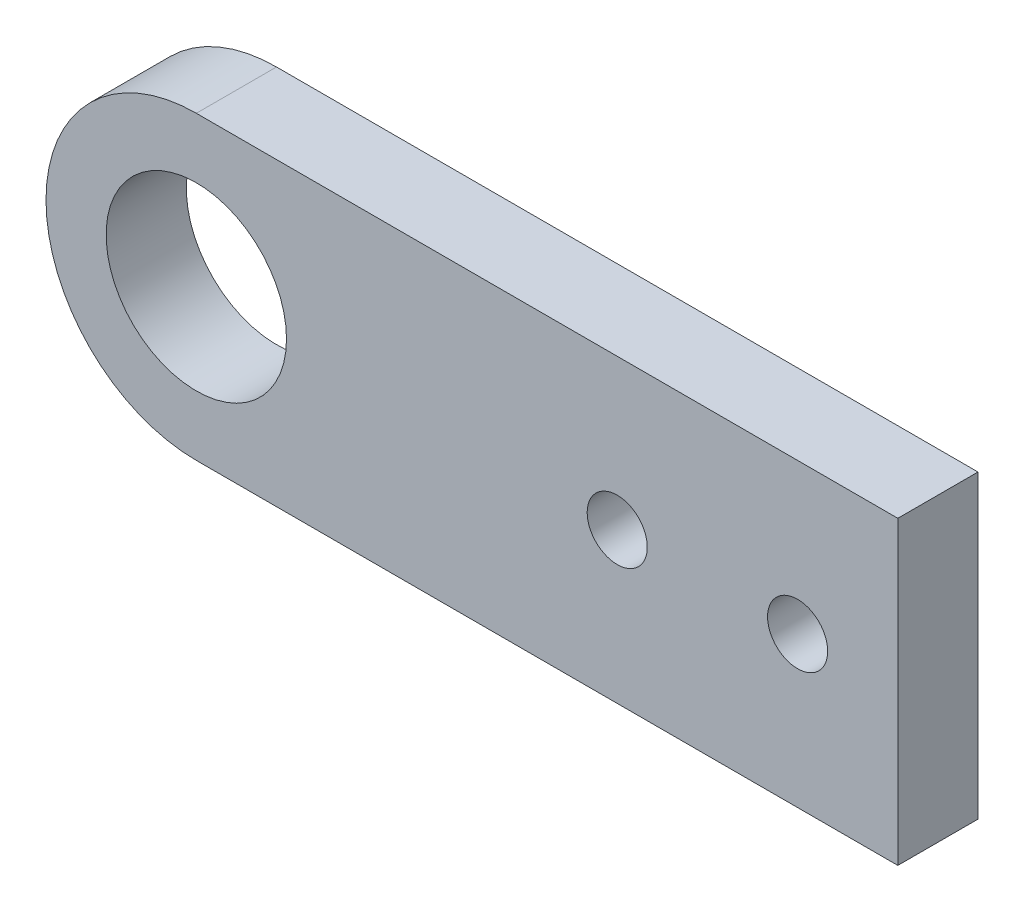
ISO-10303-21;
HEADER;
FILE_DESCRIPTION(('STEP AP214'),'2;1');
FILE_NAME('part.step','',(''),(''),'','','');
FILE_SCHEMA(('AUTOMOTIVE_DESIGN { 1 0 10303 214 1 1 1 1 }'));
ENDSEC;
DATA;
#1=APPLICATION_CONTEXT('core data for automotive mechanical design processes');
#2=APPLICATION_PROTOCOL_DEFINITION('international standard','automotive_design',2000,#1);
#3=PRODUCT_CONTEXT('',#1,'mechanical');
#4=PRODUCT('Part','Part','',(#3));
#5=PRODUCT_RELATED_PRODUCT_CATEGORY('part','',(#4));
#6=PRODUCT_DEFINITION_FORMATION('','',#4);
#7=PRODUCT_DEFINITION_CONTEXT('part definition',#1,'design');
#8=PRODUCT_DEFINITION('design','',#6,#7);
#9=PRODUCT_DEFINITION_SHAPE('','',#8);
#10=(LENGTH_UNIT() NAMED_UNIT(*) SI_UNIT(.MILLI.,.METRE.));
#11=(NAMED_UNIT(*) PLANE_ANGLE_UNIT() SI_UNIT($,.RADIAN.));
#12=(NAMED_UNIT(*) SI_UNIT($,.STERADIAN.) SOLID_ANGLE_UNIT());
#13=UNCERTAINTY_MEASURE_WITH_UNIT(LENGTH_MEASURE(1.E-05),#10,'distance_accuracy_value','');
#14=(GEOMETRIC_REPRESENTATION_CONTEXT(3) GLOBAL_UNCERTAINTY_ASSIGNED_CONTEXT((#13)) GLOBAL_UNIT_ASSIGNED_CONTEXT((#10,
#11,#12)) REPRESENTATION_CONTEXT('',''));
#15=CARTESIAN_POINT('',(0.,0.,0.));
#16=DIRECTION('',(0.,0.,1.));
#17=DIRECTION('',(1.,0.,0.));
#18=AXIS2_PLACEMENT_3D('',#15,#16,#17);
#19=CARTESIAN_POINT('',(0.,15.,8.));
#20=DIRECTION('',(0.,0.,-1.));
#21=DIRECTION('',(-1.,0.,0.));
#22=AXIS2_PLACEMENT_3D('',#19,#20,#21);
#23=CYLINDRICAL_SURFACE('',#22,15.);
#24=CARTESIAN_POINT('',(0.,15.,0.));
#25=DIRECTION('',(0.,0.,1.));
#26=DIRECTION('',(1.,0.,0.));
#27=AXIS2_PLACEMENT_3D('',#24,#25,#26);
#28=CIRCLE('',#27,15.);
#29=CARTESIAN_POINT('',(0.,30.,0.));
#30=VERTEX_POINT('',#29);
#31=CARTESIAN_POINT('',(0.,0.,0.));
#32=VERTEX_POINT('',#31);
#33=EDGE_CURVE('E107',#30,#32,#28,.T.);
#34=ORIENTED_EDGE('',*,*,#33,.T.);
#35=DIRECTION('',(0.,0.,-1.));
#36=VECTOR('',#35,1.);
#37=CARTESIAN_POINT('',(0.,0.,8.));
#38=LINE('',#37,#36);
#39=CARTESIAN_POINT('',(0.,0.,8.));
#40=VERTEX_POINT('',#39);
#41=EDGE_CURVE('E11',#40,#32,#38,.T.);
#42=ORIENTED_EDGE('',*,*,#41,.F.);
#43=CARTESIAN_POINT('',(0.,15.,8.));
#44=DIRECTION('',(0.,0.,1.));
#45=DIRECTION('',(1.,0.,0.));
#46=AXIS2_PLACEMENT_3D('',#43,#44,#45);
#47=CIRCLE('',#46,15.);
#48=CARTESIAN_POINT('',(0.,30.,8.));
#49=VERTEX_POINT('',#48);
#50=EDGE_CURVE('E93',#49,#40,#47,.T.);
#51=ORIENTED_EDGE('',*,*,#50,.F.);
#52=DIRECTION('',(0.,0.,-1.));
#53=VECTOR('',#52,1.);
#54=CARTESIAN_POINT('',(0.,30.,8.));
#55=LINE('',#54,#53);
#56=EDGE_CURVE('E60',#49,#30,#55,.T.);
#57=ORIENTED_EDGE('',*,*,#56,.T.);
#58=EDGE_LOOP('',(#34,#42,#51,#57));
#59=FACE_BOUND('',#58,.T.);
#60=ADVANCED_FACE('F44',(#59),#23,.T.);
#61=CARTESIAN_POINT('',(0.,0.,8.));
#62=DIRECTION('',(0.,1.,0.));
#63=DIRECTION('',(0.,0.,1.));
#64=AXIS2_PLACEMENT_3D('',#61,#62,#63);
#65=PLANE('',#64);
#66=DIRECTION('',(1.,0.,0.));
#67=VECTOR('',#66,1.);
#68=CARTESIAN_POINT('',(0.,0.,0.));
#69=LINE('',#68,#67);
#70=CARTESIAN_POINT('',(70.,0.,0.));
#71=VERTEX_POINT('',#70);
#72=EDGE_CURVE('E98',#32,#71,#69,.T.);
#73=ORIENTED_EDGE('',*,*,#72,.T.);
#74=DIRECTION('',(0.,0.,-1.));
#75=VECTOR('',#74,1.);
#76=CARTESIAN_POINT('',(70.,0.,8.));
#77=LINE('',#76,#75);
#78=CARTESIAN_POINT('',(70.,0.,8.));
#79=VERTEX_POINT('',#78);
#80=EDGE_CURVE('E52',#79,#71,#77,.T.);
#81=ORIENTED_EDGE('',*,*,#80,.F.);
#82=DIRECTION('',(1.,0.,0.));
#83=VECTOR('',#82,1.);
#84=CARTESIAN_POINT('',(0.,0.,8.));
#85=LINE('',#84,#83);
#86=EDGE_CURVE('E85',#40,#79,#85,.T.);
#87=ORIENTED_EDGE('',*,*,#86,.F.);
#88=ORIENTED_EDGE('',*,*,#41,.T.);
#89=EDGE_LOOP('',(#73,#81,#87,#88));
#90=FACE_BOUND('',#89,.T.);
#91=ADVANCED_FACE('F97',(#90),#65,.F.);
#92=CARTESIAN_POINT('',(70.,30.,8.));
#93=DIRECTION('',(1.,0.,0.));
#94=DIRECTION('',(0.,1.,0.));
#95=AXIS2_PLACEMENT_3D('',#92,#93,#94);
#96=PLANE('',#95);
#97=DIRECTION('',(0.,-1.,0.));
#98=VECTOR('',#97,1.);
#99=CARTESIAN_POINT('',(70.,30.,0.));
#100=LINE('',#99,#98);
#101=CARTESIAN_POINT('',(70.,30.,0.));
#102=VERTEX_POINT('',#101);
#103=EDGE_CURVE('E111',#102,#71,#100,.T.);
#104=ORIENTED_EDGE('',*,*,#103,.F.);
#105=DIRECTION('',(0.,0.,-1.));
#106=VECTOR('',#105,1.);
#107=CARTESIAN_POINT('',(70.,30.,8.));
#108=LINE('',#107,#106);
#109=CARTESIAN_POINT('',(70.,30.,8.));
#110=VERTEX_POINT('',#109);
#111=EDGE_CURVE('E74',#110,#102,#108,.T.);
#112=ORIENTED_EDGE('',*,*,#111,.F.);
#113=DIRECTION('',(0.,-1.,0.));
#114=VECTOR('',#113,1.);
#115=CARTESIAN_POINT('',(70.,30.,8.));
#116=LINE('',#115,#114);
#117=EDGE_CURVE('E92',#110,#79,#116,.T.);
#118=ORIENTED_EDGE('',*,*,#117,.T.);
#119=ORIENTED_EDGE('',*,*,#80,.T.);
#120=EDGE_LOOP('',(#104,#112,#118,#119));
#121=FACE_BOUND('',#120,.T.);
#122=ADVANCED_FACE('F101',(#121),#96,.T.);
#123=CARTESIAN_POINT('',(0.,30.,8.));
#124=DIRECTION('',(0.,1.,0.));
#125=DIRECTION('',(0.,0.,1.));
#126=AXIS2_PLACEMENT_3D('',#123,#124,#125);
#127=PLANE('',#126);
#128=DIRECTION('',(1.,0.,0.));
#129=VECTOR('',#128,1.);
#130=CARTESIAN_POINT('',(0.,30.,0.));
#131=LINE('',#130,#129);
#132=EDGE_CURVE('E113',#30,#102,#131,.T.);
#133=ORIENTED_EDGE('',*,*,#132,.F.);
#134=ORIENTED_EDGE('',*,*,#56,.F.);
#135=DIRECTION('',(1.,0.,0.));
#136=VECTOR('',#135,1.);
#137=CARTESIAN_POINT('',(0.,30.,8.));
#138=LINE('',#137,#136);
#139=EDGE_CURVE('E102',#49,#110,#138,.T.);
#140=ORIENTED_EDGE('',*,*,#139,.T.);
#141=ORIENTED_EDGE('',*,*,#111,.T.);
#142=EDGE_LOOP('',(#133,#134,#140,#141));
#143=FACE_BOUND('',#142,.T.);
#144=ADVANCED_FACE('F147',(#143),#127,.T.);
#145=CARTESIAN_POINT('',(0.,15.,8.));
#146=DIRECTION('',(0.,0.,1.));
#147=DIRECTION('',(1.,0.,0.));
#148=AXIS2_PLACEMENT_3D('',#145,#146,#147);
#149=PLANE('',#148);
#150=CARTESIAN_POINT('',(42.,15.,8.));
#151=DIRECTION('',(0.,0.,-1.));
#152=DIRECTION('',(-1.,0.,0.));
#153=AXIS2_PLACEMENT_3D('',#150,#151,#152);
#154=CIRCLE('',#153,3.);
#155=CARTESIAN_POINT('',(39.,15.,8.));
#156=VERTEX_POINT('',#155);
#157=EDGE_CURVE('E130',#156,#156,#154,.T.);
#158=ORIENTED_EDGE('',*,*,#157,.T.);
#159=EDGE_LOOP('',(#158));
#160=FACE_BOUND('',#159,.T.);
#161=CARTESIAN_POINT('',(60.,15.,8.));
#162=DIRECTION('',(0.,0.,-1.));
#163=DIRECTION('',(-1.,0.,0.));
#164=AXIS2_PLACEMENT_3D('',#161,#162,#163);
#165=CIRCLE('',#164,3.);
#166=CARTESIAN_POINT('',(57.,15.,8.));
#167=VERTEX_POINT('',#166);
#168=EDGE_CURVE('E124',#167,#167,#165,.T.);
#169=ORIENTED_EDGE('',*,*,#168,.T.);
#170=EDGE_LOOP('',(#169));
#171=FACE_BOUND('',#170,.T.);
#172=CARTESIAN_POINT('',(0.,15.,8.));
#173=DIRECTION('',(0.,0.,1.));
#174=DIRECTION('',(1.,0.,0.));
#175=AXIS2_PLACEMENT_3D('',#172,#173,#174);
#176=CIRCLE('',#175,9.);
#177=CARTESIAN_POINT('',(8.99999999999999,15.,8.));
#178=VERTEX_POINT('',#177);
#179=EDGE_CURVE('E121',#178,#178,#176,.T.);
#180=ORIENTED_EDGE('',*,*,#179,.F.);
#181=EDGE_LOOP('',(#180));
#182=FACE_BOUND('',#181,.T.);
#183=ORIENTED_EDGE('',*,*,#50,.T.);
#184=ORIENTED_EDGE('',*,*,#86,.T.);
#185=ORIENTED_EDGE('',*,*,#117,.F.);
#186=ORIENTED_EDGE('',*,*,#139,.F.);
#187=EDGE_LOOP('',(#183,#184,#185,#186));
#188=FACE_BOUND('',#187,.T.);
#189=ADVANCED_FACE('F89',(#160,#171,#182,#188),#149,.T.);
#190=CARTESIAN_POINT('',(0.,15.,0.));
#191=DIRECTION('',(0.,0.,1.));
#192=DIRECTION('',(1.,0.,0.));
#193=AXIS2_PLACEMENT_3D('',#190,#191,#192);
#194=PLANE('',#193);
#195=CARTESIAN_POINT('',(42.,15.,0.));
#196=DIRECTION('',(0.,0.,-1.));
#197=DIRECTION('',(-1.,0.,0.));
#198=AXIS2_PLACEMENT_3D('',#195,#196,#197);
#199=CIRCLE('',#198,3.);
#200=CARTESIAN_POINT('',(39.,15.,0.));
#201=VERTEX_POINT('',#200);
#202=EDGE_CURVE('E133',#201,#201,#199,.T.);
#203=ORIENTED_EDGE('',*,*,#202,.F.);
#204=EDGE_LOOP('',(#203));
#205=FACE_BOUND('',#204,.T.);
#206=CARTESIAN_POINT('',(60.,15.,0.));
#207=DIRECTION('',(0.,0.,-1.));
#208=DIRECTION('',(-1.,0.,0.));
#209=AXIS2_PLACEMENT_3D('',#206,#207,#208);
#210=CIRCLE('',#209,3.);
#211=CARTESIAN_POINT('',(57.,15.,0.));
#212=VERTEX_POINT('',#211);
#213=EDGE_CURVE('E127',#212,#212,#210,.T.);
#214=ORIENTED_EDGE('',*,*,#213,.F.);
#215=EDGE_LOOP('',(#214));
#216=FACE_BOUND('',#215,.T.);
#217=CARTESIAN_POINT('',(0.,15.,0.));
#218=DIRECTION('',(0.,0.,1.));
#219=DIRECTION('',(1.,0.,0.));
#220=AXIS2_PLACEMENT_3D('',#217,#218,#219);
#221=CIRCLE('',#220,9.);
#222=CARTESIAN_POINT('',(8.99999999999999,15.,0.));
#223=VERTEX_POINT('',#222);
#224=EDGE_CURVE('E109',#223,#223,#221,.F.);
#225=ORIENTED_EDGE('',*,*,#224,.F.);
#226=EDGE_LOOP('',(#225));
#227=FACE_BOUND('',#226,.T.);
#228=ORIENTED_EDGE('',*,*,#33,.F.);
#229=ORIENTED_EDGE('',*,*,#132,.T.);
#230=ORIENTED_EDGE('',*,*,#103,.T.);
#231=ORIENTED_EDGE('',*,*,#72,.F.);
#232=EDGE_LOOP('',(#228,#229,#230,#231));
#233=FACE_BOUND('',#232,.T.);
#234=ADVANCED_FACE('F139',(#205,#216,#227,#233),#194,.F.);
#235=CARTESIAN_POINT('',(0.,15.,-0.000999999999999265));
#236=DIRECTION('',(0.,0.,1.));
#237=DIRECTION('',(1.,0.,0.));
#238=AXIS2_PLACEMENT_3D('',#235,#236,#237);
#239=CYLINDRICAL_SURFACE('',#238,9.);
#240=ORIENTED_EDGE('',*,*,#179,.T.);
#241=EDGE_LOOP('',(#240));
#242=FACE_BOUND('',#241,.T.);
#243=ORIENTED_EDGE('',*,*,#224,.T.);
#244=EDGE_LOOP('',(#243));
#245=FACE_BOUND('',#244,.T.);
#246=ADVANCED_FACE('F142',(#242,#245),#239,.F.);
#247=CARTESIAN_POINT('',(60.,15.,0.));
#248=DIRECTION('',(0.,0.,-1.));
#249=DIRECTION('',(-1.,0.,0.));
#250=AXIS2_PLACEMENT_3D('',#247,#248,#249);
#251=CYLINDRICAL_SURFACE('',#250,3.);
#252=ORIENTED_EDGE('',*,*,#168,.F.);
#253=EDGE_LOOP('',(#252));
#254=FACE_BOUND('',#253,.T.);
#255=ORIENTED_EDGE('',*,*,#213,.T.);
#256=EDGE_LOOP('',(#255));
#257=FACE_BOUND('',#256,.T.);
#258=ADVANCED_FACE('F187',(#254,#257),#251,.F.);
#259=CARTESIAN_POINT('',(42.,15.,0.));
#260=DIRECTION('',(0.,0.,-1.));
#261=DIRECTION('',(-1.,0.,0.));
#262=AXIS2_PLACEMENT_3D('',#259,#260,#261);
#263=CYLINDRICAL_SURFACE('',#262,3.);
#264=ORIENTED_EDGE('',*,*,#157,.F.);
#265=EDGE_LOOP('',(#264));
#266=FACE_BOUND('',#265,.T.);
#267=ORIENTED_EDGE('',*,*,#202,.T.);
#268=EDGE_LOOP('',(#267));
#269=FACE_BOUND('',#268,.T.);
#270=ADVANCED_FACE('F137',(#266,#269),#263,.F.);
#271=CLOSED_SHELL('',(#60,#91,#122,#144,#189,#234,#246,#258,#270));
#272=MANIFOLD_SOLID_BREP('B2',#271);
#273=ADVANCED_BREP_SHAPE_REPRESENTATION('',(#18,#272),#14);
#274=SHAPE_DEFINITION_REPRESENTATION(#9,#273);
ENDSEC;
END-ISO-10303-21;
